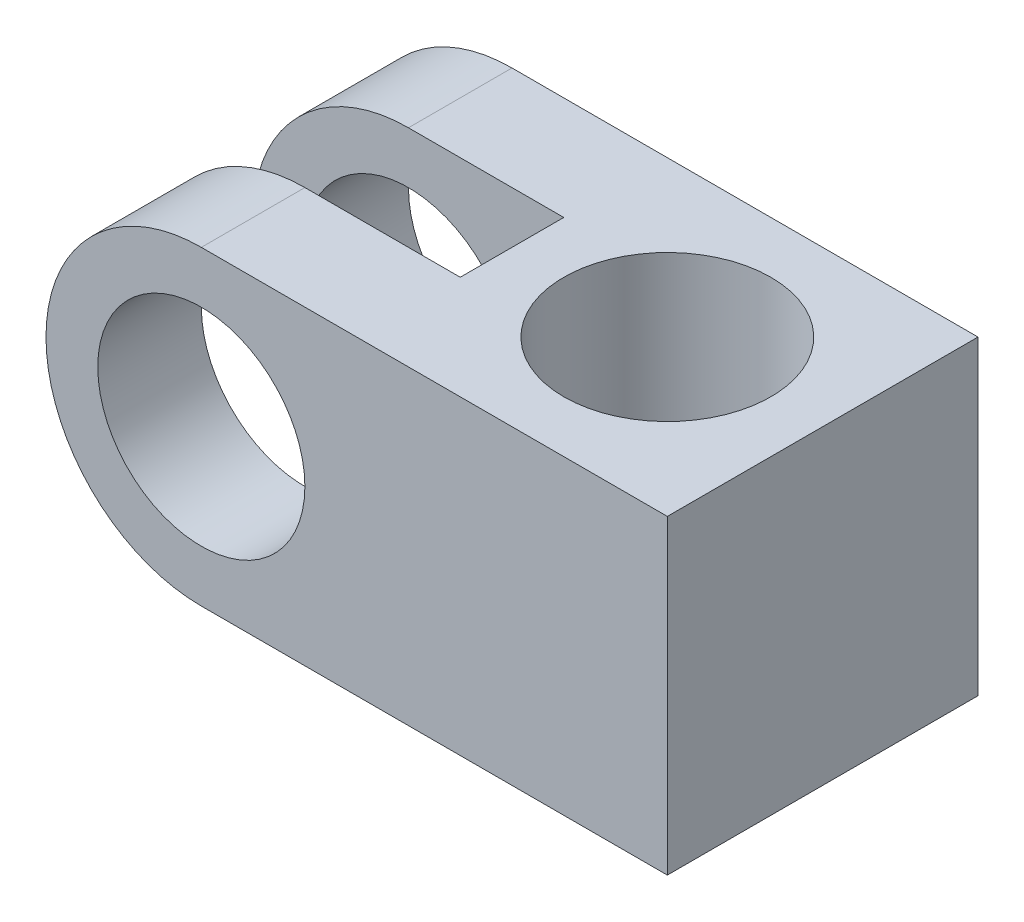
ISO-10303-21;
HEADER;
FILE_DESCRIPTION(('STEP AP214'),'2;1');
FILE_NAME('part.step','',(''),(''),'','','');
FILE_SCHEMA(('AUTOMOTIVE_DESIGN { 1 0 10303 214 1 1 1 1 }'));
ENDSEC;
DATA;
#1=APPLICATION_CONTEXT('core data for automotive mechanical design processes');
#2=APPLICATION_PROTOCOL_DEFINITION('international standard','automotive_design',2000,#1);
#3=PRODUCT_CONTEXT('',#1,'mechanical');
#4=PRODUCT('Part','Part','',(#3));
#5=PRODUCT_RELATED_PRODUCT_CATEGORY('part','',(#4));
#6=PRODUCT_DEFINITION_FORMATION('','',#4);
#7=PRODUCT_DEFINITION_CONTEXT('part definition',#1,'design');
#8=PRODUCT_DEFINITION('design','',#6,#7);
#9=PRODUCT_DEFINITION_SHAPE('','',#8);
#10=(LENGTH_UNIT() NAMED_UNIT(*) SI_UNIT(.MILLI.,.METRE.));
#11=(NAMED_UNIT(*) PLANE_ANGLE_UNIT() SI_UNIT($,.RADIAN.));
#12=(NAMED_UNIT(*) SI_UNIT($,.STERADIAN.) SOLID_ANGLE_UNIT());
#13=UNCERTAINTY_MEASURE_WITH_UNIT(LENGTH_MEASURE(1.E-05),#10,'distance_accuracy_value','');
#14=(GEOMETRIC_REPRESENTATION_CONTEXT(3) GLOBAL_UNCERTAINTY_ASSIGNED_CONTEXT((#13)) GLOBAL_UNIT_ASSIGNED_CONTEXT((#10,
#11,#12)) REPRESENTATION_CONTEXT('',''));
#15=CARTESIAN_POINT('',(0.,0.,0.));
#16=DIRECTION('',(0.,0.,1.));
#17=DIRECTION('',(1.,0.,0.));
#18=AXIS2_PLACEMENT_3D('',#15,#16,#17);
#19=CARTESIAN_POINT('',(0.,15.,0.));
#20=DIRECTION('',(0.,1.,0.));
#21=DIRECTION('',(0.,0.,1.));
#22=AXIS2_PLACEMENT_3D('',#19,#20,#21);
#23=PLANE('',#22);
#24=DIRECTION('',(-1.,0.,0.));
#25=VECTOR('',#24,1.);
#26=CARTESIAN_POINT('',(-15.,15.,5.));
#27=LINE('',#26,#25);
#28=CARTESIAN_POINT('',(-15.,15.,5.));
#29=VERTEX_POINT('',#28);
#30=CARTESIAN_POINT('',(-30.,15.,5.));
#31=VERTEX_POINT('',#30);
#32=EDGE_CURVE('E181',#29,#31,#27,.T.);
#33=ORIENTED_EDGE('',*,*,#32,.T.);
#34=DIRECTION('',(0.,0.,1.));
#35=VECTOR('',#34,1.);
#36=CARTESIAN_POINT('',(-30.,15.,15.));
#37=LINE('',#36,#35);
#38=CARTESIAN_POINT('',(-30.,15.,15.));
#39=VERTEX_POINT('',#38);
#40=EDGE_CURVE('E156',#31,#39,#37,.T.);
#41=ORIENTED_EDGE('',*,*,#40,.T.);
#42=DIRECTION('',(1.,0.,0.));
#43=VECTOR('',#42,1.);
#44=CARTESIAN_POINT('',(-45.,15.,15.));
#45=LINE('',#44,#43);
#46=CARTESIAN_POINT('',(15.,15.,15.));
#47=VERTEX_POINT('',#46);
#48=EDGE_CURVE('E124',#39,#47,#45,.T.);
#49=ORIENTED_EDGE('',*,*,#48,.T.);
#50=DIRECTION('',(0.,0.,-1.));
#51=VECTOR('',#50,1.);
#52=CARTESIAN_POINT('',(15.,15.,-15.));
#53=LINE('',#52,#51);
#54=CARTESIAN_POINT('',(15.,15.,-15.));
#55=VERTEX_POINT('',#54);
#56=EDGE_CURVE('E118',#47,#55,#53,.T.);
#57=ORIENTED_EDGE('',*,*,#56,.T.);
#58=DIRECTION('',(-1.,0.,0.));
#59=VECTOR('',#58,1.);
#60=CARTESIAN_POINT('',(-45.,15.,-15.));
#61=LINE('',#60,#59);
#62=CARTESIAN_POINT('',(-30.,15.,-15.));
#63=VERTEX_POINT('',#62);
#64=EDGE_CURVE('E109',#55,#63,#61,.T.);
#65=ORIENTED_EDGE('',*,*,#64,.T.);
#66=DIRECTION('',(0.,0.,1.));
#67=VECTOR('',#66,1.);
#68=CARTESIAN_POINT('',(-30.,15.,-5.));
#69=LINE('',#68,#67);
#70=CARTESIAN_POINT('',(-30.,15.,-5.));
#71=VERTEX_POINT('',#70);
#72=EDGE_CURVE('E154',#63,#71,#69,.T.);
#73=ORIENTED_EDGE('',*,*,#72,.T.);
#74=DIRECTION('',(1.,0.,0.));
#75=VECTOR('',#74,1.);
#76=CARTESIAN_POINT('',(-45.,15.,-5.));
#77=LINE('',#76,#75);
#78=CARTESIAN_POINT('',(-15.,15.,-5.));
#79=VERTEX_POINT('',#78);
#80=EDGE_CURVE('E117',#71,#79,#77,.T.);
#81=ORIENTED_EDGE('',*,*,#80,.T.);
#82=DIRECTION('',(0.,0.,1.));
#83=VECTOR('',#82,1.);
#84=CARTESIAN_POINT('',(-15.,15.,-5.));
#85=LINE('',#84,#83);
#86=EDGE_CURVE('E179',#79,#29,#85,.T.);
#87=ORIENTED_EDGE('',*,*,#86,.T.);
#88=EDGE_LOOP('',(#33,#41,#49,#57,#65,#73,#81,#87));
#89=FACE_BOUND('',#88,.T.);
#90=CARTESIAN_POINT('',(0.,15.,0.));
#91=DIRECTION('',(0.,1.,0.));
#92=DIRECTION('',(0.,0.,1.));
#93=AXIS2_PLACEMENT_3D('',#90,#91,#92);
#94=CIRCLE('',#93,10.);
#95=CARTESIAN_POINT('',(0.,15.,10.));
#96=VERTEX_POINT('',#95);
#97=EDGE_CURVE('E189',#96,#96,#94,.T.);
#98=ORIENTED_EDGE('',*,*,#97,.F.);
#99=EDGE_LOOP('',(#98));
#100=FACE_BOUND('',#99,.T.);
#101=ADVANCED_FACE('F32',(#89,#100),#23,.T.);
#102=CARTESIAN_POINT('',(0.,-15.,0.));
#103=DIRECTION('',(0.,1.,0.));
#104=DIRECTION('',(0.,0.,1.));
#105=AXIS2_PLACEMENT_3D('',#102,#103,#104);
#106=PLANE('',#105);
#107=DIRECTION('',(1.,0.,0.));
#108=VECTOR('',#107,1.);
#109=CARTESIAN_POINT('',(-45.,-15.,15.));
#110=LINE('',#109,#108);
#111=CARTESIAN_POINT('',(-30.,-15.,15.));
#112=VERTEX_POINT('',#111);
#113=CARTESIAN_POINT('',(15.,-15.,15.));
#114=VERTEX_POINT('',#113);
#115=EDGE_CURVE('E128',#112,#114,#110,.T.);
#116=ORIENTED_EDGE('',*,*,#115,.F.);
#117=DIRECTION('',(0.,0.,1.));
#118=VECTOR('',#117,1.);
#119=CARTESIAN_POINT('',(-30.,-15.,0.));
#120=LINE('',#119,#118);
#121=CARTESIAN_POINT('',(-30.,-15.,5.));
#122=VERTEX_POINT('',#121);
#123=EDGE_CURVE('E147',#112,#122,#120,.F.);
#124=ORIENTED_EDGE('',*,*,#123,.T.);
#125=DIRECTION('',(-1.,0.,0.));
#126=VECTOR('',#125,1.);
#127=CARTESIAN_POINT('',(-15.,-15.,5.));
#128=LINE('',#127,#126);
#129=CARTESIAN_POINT('',(-15.,-15.,5.));
#130=VERTEX_POINT('',#129);
#131=EDGE_CURVE('E195',#130,#122,#128,.T.);
#132=ORIENTED_EDGE('',*,*,#131,.F.);
#133=DIRECTION('',(0.,0.,1.));
#134=VECTOR('',#133,1.);
#135=CARTESIAN_POINT('',(-15.,-15.,-5.));
#136=LINE('',#135,#134);
#137=CARTESIAN_POINT('',(-15.,-15.,-5.));
#138=VERTEX_POINT('',#137);
#139=EDGE_CURVE('E193',#138,#130,#136,.T.);
#140=ORIENTED_EDGE('',*,*,#139,.F.);
#141=DIRECTION('',(1.,0.,0.));
#142=VECTOR('',#141,1.);
#143=CARTESIAN_POINT('',(-45.,-15.,-5.));
#144=LINE('',#143,#142);
#145=CARTESIAN_POINT('',(-30.,-15.,-5.));
#146=VERTEX_POINT('',#145);
#147=EDGE_CURVE('E191',#146,#138,#144,.T.);
#148=ORIENTED_EDGE('',*,*,#147,.F.);
#149=DIRECTION('',(0.,0.,1.));
#150=VECTOR('',#149,1.);
#151=CARTESIAN_POINT('',(-30.,-15.,0.));
#152=LINE('',#151,#150);
#153=CARTESIAN_POINT('',(-30.,-15.,-15.));
#154=VERTEX_POINT('',#153);
#155=EDGE_CURVE('E144',#146,#154,#152,.F.);
#156=ORIENTED_EDGE('',*,*,#155,.T.);
#157=DIRECTION('',(-1.,0.,0.));
#158=VECTOR('',#157,1.);
#159=CARTESIAN_POINT('',(-45.,-15.,-15.));
#160=LINE('',#159,#158);
#161=CARTESIAN_POINT('',(15.,-15.,-15.));
#162=VERTEX_POINT('',#161);
#163=EDGE_CURVE('E188',#162,#154,#160,.T.);
#164=ORIENTED_EDGE('',*,*,#163,.F.);
#165=DIRECTION('',(0.,0.,-1.));
#166=VECTOR('',#165,1.);
#167=CARTESIAN_POINT('',(15.,-15.,-15.));
#168=LINE('',#167,#166);
#169=EDGE_CURVE('E132',#114,#162,#168,.T.);
#170=ORIENTED_EDGE('',*,*,#169,.F.);
#171=EDGE_LOOP('',(#116,#124,#132,#140,#148,#156,#164,#170));
#172=FACE_BOUND('',#171,.T.);
#173=CARTESIAN_POINT('',(0.,-15.,0.));
#174=DIRECTION('',(0.,1.,0.));
#175=DIRECTION('',(0.,0.,1.));
#176=AXIS2_PLACEMENT_3D('',#173,#174,#175);
#177=CIRCLE('',#176,10.);
#178=CARTESIAN_POINT('',(0.,-15.,10.));
#179=VERTEX_POINT('',#178);
#180=EDGE_CURVE('E260',#179,#179,#177,.T.);
#181=ORIENTED_EDGE('',*,*,#180,.T.);
#182=EDGE_LOOP('',(#181));
#183=FACE_BOUND('',#182,.T.);
#184=ADVANCED_FACE('F209',(#172,#183),#106,.F.);
#185=CARTESIAN_POINT('',(15.,15.,-15.));
#186=DIRECTION('',(-1.,0.,0.));
#187=DIRECTION('',(0.,0.,1.));
#188=AXIS2_PLACEMENT_3D('',#185,#186,#187);
#189=PLANE('',#188);
#190=ORIENTED_EDGE('',*,*,#169,.T.);
#191=DIRECTION('',(0.,-1.,0.));
#192=VECTOR('',#191,1.);
#193=CARTESIAN_POINT('',(15.,15.,-15.));
#194=LINE('',#193,#192);
#195=EDGE_CURVE('E113',#55,#162,#194,.T.);
#196=ORIENTED_EDGE('',*,*,#195,.F.);
#197=ORIENTED_EDGE('',*,*,#56,.F.);
#198=DIRECTION('',(0.,-1.,0.));
#199=VECTOR('',#198,1.);
#200=CARTESIAN_POINT('',(15.,15.,15.));
#201=LINE('',#200,#199);
#202=EDGE_CURVE('E186',#47,#114,#201,.T.);
#203=ORIENTED_EDGE('',*,*,#202,.T.);
#204=EDGE_LOOP('',(#190,#196,#197,#203));
#205=FACE_BOUND('',#204,.T.);
#206=ADVANCED_FACE('F130',(#205),#189,.F.);
#207=CARTESIAN_POINT('',(-45.,15.,-15.));
#208=DIRECTION('',(0.,0.,1.));
#209=DIRECTION('',(1.,0.,0.));
#210=AXIS2_PLACEMENT_3D('',#207,#208,#209);
#211=PLANE('',#210);
#212=CARTESIAN_POINT('',(-30.,0.,-15.));
#213=DIRECTION('',(0.,0.,1.));
#214=DIRECTION('',(1.,0.,0.));
#215=AXIS2_PLACEMENT_3D('',#212,#213,#214);
#216=CIRCLE('',#215,10.);
#217=CARTESIAN_POINT('',(-20.,0.,-15.));
#218=VERTEX_POINT('',#217);
#219=EDGE_CURVE('E168',#218,#218,#216,.T.);
#220=ORIENTED_EDGE('',*,*,#219,.T.);
#221=EDGE_LOOP('',(#220));
#222=FACE_BOUND('',#221,.T.);
#223=ORIENTED_EDGE('',*,*,#163,.T.);
#224=CARTESIAN_POINT('',(-30.,0.,-15.));
#225=DIRECTION('',(0.,0.,1.));
#226=DIRECTION('',(1.,0.,0.));
#227=AXIS2_PLACEMENT_3D('',#224,#225,#226);
#228=CIRCLE('',#227,15.);
#229=CARTESIAN_POINT('',(-45.,0.,-15.));
#230=VERTEX_POINT('',#229);
#231=EDGE_CURVE('E11',#154,#230,#228,.F.);
#232=ORIENTED_EDGE('',*,*,#231,.T.);
#233=CARTESIAN_POINT('',(-30.,0.,-15.));
#234=DIRECTION('',(0.,0.,1.));
#235=DIRECTION('',(1.,0.,0.));
#236=AXIS2_PLACEMENT_3D('',#233,#234,#235);
#237=CIRCLE('',#236,15.);
#238=EDGE_CURVE('E41',#230,#63,#237,.F.);
#239=ORIENTED_EDGE('',*,*,#238,.T.);
#240=ORIENTED_EDGE('',*,*,#64,.F.);
#241=ORIENTED_EDGE('',*,*,#195,.T.);
#242=EDGE_LOOP('',(#223,#232,#239,#240,#241));
#243=FACE_BOUND('',#242,.T.);
#244=ADVANCED_FACE('F111',(#222,#243),#211,.F.);
#245=CARTESIAN_POINT('',(-45.,15.,-5.));
#246=DIRECTION('',(0.,0.,-1.));
#247=DIRECTION('',(-1.,0.,0.));
#248=AXIS2_PLACEMENT_3D('',#245,#246,#247);
#249=PLANE('',#248);
#250=CARTESIAN_POINT('',(-30.,0.,-5.));
#251=DIRECTION('',(0.,0.,-1.));
#252=DIRECTION('',(-1.,0.,0.));
#253=AXIS2_PLACEMENT_3D('',#250,#251,#252);
#254=CIRCLE('',#253,10.);
#255=CARTESIAN_POINT('',(-40.,0.,-5.));
#256=VERTEX_POINT('',#255);
#257=EDGE_CURVE('E257',#256,#256,#254,.T.);
#258=ORIENTED_EDGE('',*,*,#257,.T.);
#259=EDGE_LOOP('',(#258));
#260=FACE_BOUND('',#259,.T.);
#261=CARTESIAN_POINT('',(-30.,0.,-5.));
#262=DIRECTION('',(0.,0.,-1.));
#263=DIRECTION('',(-1.,0.,0.));
#264=AXIS2_PLACEMENT_3D('',#261,#262,#263);
#265=CIRCLE('',#264,15.);
#266=CARTESIAN_POINT('',(-45.,0.,-5.));
#267=VERTEX_POINT('',#266);
#268=EDGE_CURVE('E55',#71,#267,#265,.F.);
#269=ORIENTED_EDGE('',*,*,#268,.T.);
#270=CARTESIAN_POINT('',(-30.,0.,-5.));
#271=DIRECTION('',(0.,0.,-1.));
#272=DIRECTION('',(-1.,0.,0.));
#273=AXIS2_PLACEMENT_3D('',#270,#271,#272);
#274=CIRCLE('',#273,15.);
#275=EDGE_CURVE('E159',#267,#146,#274,.F.);
#276=ORIENTED_EDGE('',*,*,#275,.T.);
#277=ORIENTED_EDGE('',*,*,#147,.T.);
#278=DIRECTION('',(0.,-1.,0.));
#279=VECTOR('',#278,1.);
#280=CARTESIAN_POINT('',(-15.,15.,-5.));
#281=LINE('',#280,#279);
#282=EDGE_CURVE('E134',#79,#138,#281,.T.);
#283=ORIENTED_EDGE('',*,*,#282,.F.);
#284=ORIENTED_EDGE('',*,*,#80,.F.);
#285=EDGE_LOOP('',(#269,#276,#277,#283,#284));
#286=FACE_BOUND('',#285,.T.);
#287=ADVANCED_FACE('F177',(#260,#286),#249,.F.);
#288=CARTESIAN_POINT('',(-15.,15.,-5.));
#289=DIRECTION('',(1.,0.,0.));
#290=DIRECTION('',(0.,0.,-1.));
#291=AXIS2_PLACEMENT_3D('',#288,#289,#290);
#292=PLANE('',#291);
#293=ORIENTED_EDGE('',*,*,#139,.T.);
#294=DIRECTION('',(0.,-1.,0.));
#295=VECTOR('',#294,1.);
#296=CARTESIAN_POINT('',(-15.,15.,5.));
#297=LINE('',#296,#295);
#298=EDGE_CURVE('E139',#29,#130,#297,.T.);
#299=ORIENTED_EDGE('',*,*,#298,.F.);
#300=ORIENTED_EDGE('',*,*,#86,.F.);
#301=ORIENTED_EDGE('',*,*,#282,.T.);
#302=EDGE_LOOP('',(#293,#299,#300,#301));
#303=FACE_BOUND('',#302,.T.);
#304=ADVANCED_FACE('F221',(#303),#292,.F.);
#305=CARTESIAN_POINT('',(-15.,15.,5.));
#306=DIRECTION('',(0.,0.,1.));
#307=DIRECTION('',(1.,0.,0.));
#308=AXIS2_PLACEMENT_3D('',#305,#306,#307);
#309=PLANE('',#308);
#310=CARTESIAN_POINT('',(-30.,0.,5.));
#311=DIRECTION('',(0.,0.,1.));
#312=DIRECTION('',(1.,0.,0.));
#313=AXIS2_PLACEMENT_3D('',#310,#311,#312);
#314=CIRCLE('',#313,10.);
#315=CARTESIAN_POINT('',(-20.,0.,5.));
#316=VERTEX_POINT('',#315);
#317=EDGE_CURVE('E256',#316,#316,#314,.T.);
#318=ORIENTED_EDGE('',*,*,#317,.T.);
#319=EDGE_LOOP('',(#318));
#320=FACE_BOUND('',#319,.T.);
#321=ORIENTED_EDGE('',*,*,#131,.T.);
#322=CARTESIAN_POINT('',(-30.,0.,5.));
#323=DIRECTION('',(0.,0.,1.));
#324=DIRECTION('',(1.,0.,0.));
#325=AXIS2_PLACEMENT_3D('',#322,#323,#324);
#326=CIRCLE('',#325,15.);
#327=CARTESIAN_POINT('',(-45.,0.,5.));
#328=VERTEX_POINT('',#327);
#329=EDGE_CURVE('E152',#122,#328,#326,.F.);
#330=ORIENTED_EDGE('',*,*,#329,.T.);
#331=CARTESIAN_POINT('',(-30.,0.,5.));
#332=DIRECTION('',(0.,0.,1.));
#333=DIRECTION('',(1.,0.,0.));
#334=AXIS2_PLACEMENT_3D('',#331,#332,#333);
#335=CIRCLE('',#334,15.);
#336=EDGE_CURVE('E150',#328,#31,#335,.F.);
#337=ORIENTED_EDGE('',*,*,#336,.T.);
#338=ORIENTED_EDGE('',*,*,#32,.F.);
#339=ORIENTED_EDGE('',*,*,#298,.T.);
#340=EDGE_LOOP('',(#321,#330,#337,#338,#339));
#341=FACE_BOUND('',#340,.T.);
#342=ADVANCED_FACE('F204',(#320,#341),#309,.F.);
#343=CARTESIAN_POINT('',(-45.,15.,15.));
#344=DIRECTION('',(0.,0.,-1.));
#345=DIRECTION('',(-1.,0.,0.));
#346=AXIS2_PLACEMENT_3D('',#343,#344,#345);
#347=PLANE('',#346);
#348=CARTESIAN_POINT('',(-30.,0.,15.));
#349=DIRECTION('',(0.,0.,1.));
#350=DIRECTION('',(1.,0.,0.));
#351=AXIS2_PLACEMENT_3D('',#348,#349,#350);
#352=CIRCLE('',#351,10.);
#353=CARTESIAN_POINT('',(-20.,0.,15.));
#354=VERTEX_POINT('',#353);
#355=EDGE_CURVE('E163',#354,#354,#352,.T.);
#356=ORIENTED_EDGE('',*,*,#355,.F.);
#357=EDGE_LOOP('',(#356));
#358=FACE_BOUND('',#357,.T.);
#359=CARTESIAN_POINT('',(-30.,0.,15.));
#360=DIRECTION('',(0.,0.,-1.));
#361=DIRECTION('',(-1.,0.,0.));
#362=AXIS2_PLACEMENT_3D('',#359,#360,#361);
#363=CIRCLE('',#362,15.);
#364=CARTESIAN_POINT('',(-45.,0.,15.));
#365=VERTEX_POINT('',#364);
#366=EDGE_CURVE('E133',#39,#365,#363,.F.);
#367=ORIENTED_EDGE('',*,*,#366,.T.);
#368=CARTESIAN_POINT('',(-30.,0.,15.));
#369=DIRECTION('',(0.,0.,-1.));
#370=DIRECTION('',(-1.,0.,0.));
#371=AXIS2_PLACEMENT_3D('',#368,#369,#370);
#372=CIRCLE('',#371,15.);
#373=EDGE_CURVE('E136',#365,#112,#372,.F.);
#374=ORIENTED_EDGE('',*,*,#373,.T.);
#375=ORIENTED_EDGE('',*,*,#115,.T.);
#376=ORIENTED_EDGE('',*,*,#202,.F.);
#377=ORIENTED_EDGE('',*,*,#48,.F.);
#378=EDGE_LOOP('',(#367,#374,#375,#376,#377));
#379=FACE_BOUND('',#378,.T.);
#380=ADVANCED_FACE('F220',(#358,#379),#347,.F.);
#381=CARTESIAN_POINT('',(0.,15.,0.));
#382=DIRECTION('',(0.,-1.,0.));
#383=DIRECTION('',(0.,0.,-1.));
#384=AXIS2_PLACEMENT_3D('',#381,#382,#383);
#385=CYLINDRICAL_SURFACE('',#384,10.);
#386=ORIENTED_EDGE('',*,*,#97,.T.);
#387=EDGE_LOOP('',(#386));
#388=FACE_BOUND('',#387,.T.);
#389=ORIENTED_EDGE('',*,*,#180,.F.);
#390=EDGE_LOOP('',(#389));
#391=FACE_BOUND('',#390,.T.);
#392=ADVANCED_FACE('F239',(#388,#391),#385,.F.);
#393=CARTESIAN_POINT('',(-30.,0.,-15.));
#394=DIRECTION('',(0.,0.,1.));
#395=DIRECTION('',(1.,0.,0.));
#396=AXIS2_PLACEMENT_3D('',#393,#394,#395);
#397=CYLINDRICAL_SURFACE('',#396,10.);
#398=ORIENTED_EDGE('',*,*,#355,.T.);
#399=EDGE_LOOP('',(#398));
#400=FACE_BOUND('',#399,.T.);
#401=ORIENTED_EDGE('',*,*,#317,.F.);
#402=EDGE_LOOP('',(#401));
#403=FACE_BOUND('',#402,.T.);
#404=ADVANCED_FACE('F247',(#400,#403),#397,.F.);
#405=ORIENTED_EDGE('',*,*,#219,.F.);
#406=EDGE_LOOP('',(#405));
#407=FACE_BOUND('',#406,.T.);
#408=ORIENTED_EDGE('',*,*,#257,.F.);
#409=EDGE_LOOP('',(#408));
#410=FACE_BOUND('',#409,.T.);
#411=ADVANCED_FACE('F253',(#407,#410),#397,.F.);
#412=CARTESIAN_POINT('',(-30.,0.,0.));
#413=DIRECTION('',(0.,0.,-1.));
#414=DIRECTION('',(-1.,0.,0.));
#415=AXIS2_PLACEMENT_3D('',#412,#413,#414);
#416=CYLINDRICAL_SURFACE('',#415,15.);
#417=ORIENTED_EDGE('',*,*,#40,.F.);
#418=ORIENTED_EDGE('',*,*,#336,.F.);
#419=DIRECTION('',(0.,0.,1.));
#420=VECTOR('',#419,1.);
#421=CARTESIAN_POINT('',(-45.,0.,5.));
#422=LINE('',#421,#420);
#423=EDGE_CURVE('E161',#365,#328,#422,.F.);
#424=ORIENTED_EDGE('',*,*,#423,.F.);
#425=ORIENTED_EDGE('',*,*,#366,.F.);
#426=EDGE_LOOP('',(#417,#418,#424,#425));
#427=FACE_BOUND('',#426,.T.);
#428=ADVANCED_FACE('F217',(#427),#416,.T.);
#429=CARTESIAN_POINT('',(-30.,0.,4.99999999999998));
#430=DIRECTION('',(0.,0.,1.));
#431=DIRECTION('',(1.,0.,0.));
#432=AXIS2_PLACEMENT_3D('',#429,#430,#431);
#433=CYLINDRICAL_SURFACE('',#432,15.);
#434=ORIENTED_EDGE('',*,*,#329,.F.);
#435=ORIENTED_EDGE('',*,*,#123,.F.);
#436=ORIENTED_EDGE('',*,*,#373,.F.);
#437=ORIENTED_EDGE('',*,*,#423,.T.);
#438=EDGE_LOOP('',(#434,#435,#436,#437));
#439=FACE_BOUND('',#438,.T.);
#440=ADVANCED_FACE('F213',(#439),#433,.T.);
#441=CARTESIAN_POINT('',(-30.,0.,0.));
#442=DIRECTION('',(0.,0.,-1.));
#443=DIRECTION('',(-1.,0.,0.));
#444=AXIS2_PLACEMENT_3D('',#441,#442,#443);
#445=CYLINDRICAL_SURFACE('',#444,15.);
#446=ORIENTED_EDGE('',*,*,#72,.F.);
#447=ORIENTED_EDGE('',*,*,#238,.F.);
#448=DIRECTION('',(0.,0.,1.));
#449=VECTOR('',#448,1.);
#450=CARTESIAN_POINT('',(-45.,0.,-15.));
#451=LINE('',#450,#449);
#452=EDGE_CURVE('E36',#267,#230,#451,.F.);
#453=ORIENTED_EDGE('',*,*,#452,.F.);
#454=ORIENTED_EDGE('',*,*,#268,.F.);
#455=EDGE_LOOP('',(#446,#447,#453,#454));
#456=FACE_BOUND('',#455,.T.);
#457=ADVANCED_FACE('F34',(#456),#445,.T.);
#458=CARTESIAN_POINT('',(-30.,0.,-15.));
#459=DIRECTION('',(0.,0.,1.));
#460=DIRECTION('',(1.,0.,0.));
#461=AXIS2_PLACEMENT_3D('',#458,#459,#460);
#462=CYLINDRICAL_SURFACE('',#461,15.);
#463=ORIENTED_EDGE('',*,*,#231,.F.);
#464=ORIENTED_EDGE('',*,*,#155,.F.);
#465=ORIENTED_EDGE('',*,*,#275,.F.);
#466=ORIENTED_EDGE('',*,*,#452,.T.);
#467=EDGE_LOOP('',(#463,#464,#465,#466));
#468=FACE_BOUND('',#467,.T.);
#469=ADVANCED_FACE('F173',(#468),#462,.T.);
#470=CLOSED_SHELL('',(#101,#184,#206,#244,#287,#304,#342,#380,#392,#404,#411,#428,#440,#457,#469));
#471=MANIFOLD_SOLID_BREP('B2',#470);
#472=ADVANCED_BREP_SHAPE_REPRESENTATION('',(#18,#471),#14);
#473=SHAPE_DEFINITION_REPRESENTATION(#9,#472);
ENDSEC;
END-ISO-10303-21;
